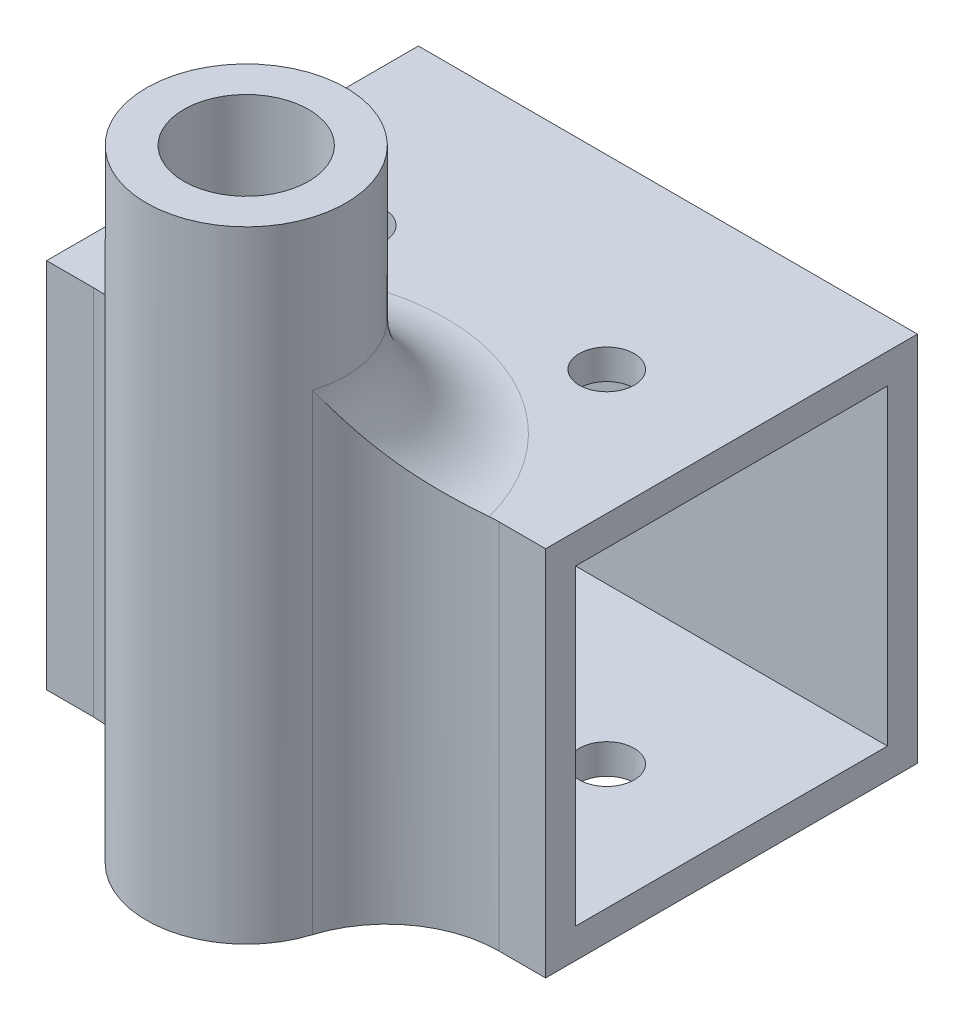
ISO-10303-21;
HEADER;
FILE_DESCRIPTION(('STEP AP214'),'2;1');
FILE_NAME('part.step','',(''),(''),'','','');
FILE_SCHEMA(('AUTOMOTIVE_DESIGN { 1 0 10303 214 1 1 1 1 }'));
ENDSEC;
DATA;
#1=APPLICATION_CONTEXT('core data for automotive mechanical design processes');
#2=APPLICATION_PROTOCOL_DEFINITION('international standard','automotive_design',2000,#1);
#3=PRODUCT_CONTEXT('',#1,'mechanical');
#4=PRODUCT('Part','Part','',(#3));
#5=PRODUCT_RELATED_PRODUCT_CATEGORY('part','',(#4));
#6=PRODUCT_DEFINITION_FORMATION('','',#4);
#7=PRODUCT_DEFINITION_CONTEXT('part definition',#1,'design');
#8=PRODUCT_DEFINITION('design','',#6,#7);
#9=PRODUCT_DEFINITION_SHAPE('','',#8);
#10=(LENGTH_UNIT() NAMED_UNIT(*) SI_UNIT(.MILLI.,.METRE.));
#11=(NAMED_UNIT(*) PLANE_ANGLE_UNIT() SI_UNIT($,.RADIAN.));
#12=(NAMED_UNIT(*) SI_UNIT($,.STERADIAN.) SOLID_ANGLE_UNIT());
#13=UNCERTAINTY_MEASURE_WITH_UNIT(LENGTH_MEASURE(1.E-05),#10,'distance_accuracy_value','');
#14=(GEOMETRIC_REPRESENTATION_CONTEXT(3) GLOBAL_UNCERTAINTY_ASSIGNED_CONTEXT((#13)) GLOBAL_UNIT_ASSIGNED_CONTEXT((#10,
#11,#12)) REPRESENTATION_CONTEXT('',''));
#15=CARTESIAN_POINT('',(0.,0.,0.));
#16=DIRECTION('',(0.,0.,1.));
#17=DIRECTION('',(1.,0.,0.));
#18=AXIS2_PLACEMENT_3D('',#15,#16,#17);
#19=CARTESIAN_POINT('',(40.,0.,14.9));
#20=DIRECTION('',(0.,0.,-1.));
#21=DIRECTION('',(-1.,0.,0.));
#22=AXIS2_PLACEMENT_3D('',#19,#20,#21);
#23=PLANE('',#22);
#24=DIRECTION('',(-1.,0.,0.));
#25=VECTOR('',#24,1.);
#26=CARTESIAN_POINT('',(40.,14.9,14.9));
#27=LINE('',#26,#25);
#28=CARTESIAN_POINT('',(40.,14.9,14.9));
#29=VERTEX_POINT('',#28);
#30=CARTESIAN_POINT('',(36.2480768092719,14.9,14.9));
#31=VERTEX_POINT('',#30);
#32=EDGE_CURVE('E230',#29,#31,#27,.T.);
#33=ORIENTED_EDGE('',*,*,#32,.T.);
#34=DIRECTION('',(0.,1.,0.));
#35=VECTOR('',#34,1.);
#36=CARTESIAN_POINT('',(36.2480768092719,-14.9,14.9));
#37=LINE('',#36,#35);
#38=CARTESIAN_POINT('',(36.2480768092719,-14.9,14.9));
#39=VERTEX_POINT('',#38);
#40=EDGE_CURVE('E241',#31,#39,#37,.F.);
#41=ORIENTED_EDGE('',*,*,#40,.T.);
#42=DIRECTION('',(-1.,0.,0.));
#43=VECTOR('',#42,1.);
#44=CARTESIAN_POINT('',(40.,-14.9,14.9));
#45=LINE('',#44,#43);
#46=CARTESIAN_POINT('',(40.,-14.9,14.9));
#47=VERTEX_POINT('',#46);
#48=EDGE_CURVE('E226',#47,#39,#45,.T.);
#49=ORIENTED_EDGE('',*,*,#48,.F.);
#50=DIRECTION('',(0.,-1.,0.));
#51=VECTOR('',#50,1.);
#52=CARTESIAN_POINT('',(40.,0.,14.9));
#53=LINE('',#52,#51);
#54=EDGE_CURVE('E209',#29,#47,#53,.T.);
#55=ORIENTED_EDGE('',*,*,#54,.F.);
#56=EDGE_LOOP('',(#33,#41,#49,#55));
#57=FACE_BOUND('',#56,.T.);
#58=ADVANCED_FACE('F57',(#57),#23,.F.);
#59=CARTESIAN_POINT('',(3.75192319072808,-14.9,14.9));
#60=VERTEX_POINT('',#59);
#61=CARTESIAN_POINT('',(0.,-14.9,14.9));
#62=VERTEX_POINT('',#61);
#63=EDGE_CURVE('E225',#60,#62,#45,.T.);
#64=ORIENTED_EDGE('',*,*,#63,.F.);
#65=DIRECTION('',(0.,1.,0.));
#66=VECTOR('',#65,1.);
#67=CARTESIAN_POINT('',(3.75192319072808,14.9,14.9));
#68=LINE('',#67,#66);
#69=CARTESIAN_POINT('',(3.75192319072808,14.9,14.9));
#70=VERTEX_POINT('',#69);
#71=EDGE_CURVE('E243',#60,#70,#68,.T.);
#72=ORIENTED_EDGE('',*,*,#71,.T.);
#73=CARTESIAN_POINT('',(0.,14.9,14.9));
#74=VERTEX_POINT('',#73);
#75=EDGE_CURVE('E229',#70,#74,#27,.T.);
#76=ORIENTED_EDGE('',*,*,#75,.T.);
#77=DIRECTION('',(0.,-1.,0.));
#78=VECTOR('',#77,1.);
#79=CARTESIAN_POINT('',(0.,0.,14.9));
#80=LINE('',#79,#78);
#81=EDGE_CURVE('E219',#74,#62,#80,.T.);
#82=ORIENTED_EDGE('',*,*,#81,.T.);
#83=EDGE_LOOP('',(#64,#72,#76,#82));
#84=FACE_BOUND('',#83,.T.);
#85=ADVANCED_FACE('F292',(#84),#23,.F.);
#86=CARTESIAN_POINT('',(40.,-12.5,12.5));
#87=DIRECTION('',(0.,0.,-1.));
#88=DIRECTION('',(-1.,0.,0.));
#89=AXIS2_PLACEMENT_3D('',#86,#87,#88);
#90=PLANE('',#89);
#91=DIRECTION('',(0.,-1.,0.));
#92=VECTOR('',#91,1.);
#93=CARTESIAN_POINT('',(0.,-12.5,12.5));
#94=LINE('',#93,#92);
#95=CARTESIAN_POINT('',(0.,12.5,12.5));
#96=VERTEX_POINT('',#95);
#97=CARTESIAN_POINT('',(0.,-12.5,12.5));
#98=VERTEX_POINT('',#97);
#99=EDGE_CURVE('E194',#96,#98,#94,.T.);
#100=ORIENTED_EDGE('',*,*,#99,.F.);
#101=DIRECTION('',(-1.,0.,0.));
#102=VECTOR('',#101,1.);
#103=CARTESIAN_POINT('',(40.,12.5,12.5));
#104=LINE('',#103,#102);
#105=CARTESIAN_POINT('',(40.,12.5,12.5));
#106=VERTEX_POINT('',#105);
#107=EDGE_CURVE('E178',#106,#96,#104,.T.);
#108=ORIENTED_EDGE('',*,*,#107,.F.);
#109=DIRECTION('',(0.,-1.,0.));
#110=VECTOR('',#109,1.);
#111=CARTESIAN_POINT('',(40.,-12.5,12.5));
#112=LINE('',#111,#110);
#113=CARTESIAN_POINT('',(40.,-12.5,12.5));
#114=VERTEX_POINT('',#113);
#115=EDGE_CURVE('E183',#106,#114,#112,.T.);
#116=ORIENTED_EDGE('',*,*,#115,.T.);
#117=DIRECTION('',(-1.,0.,0.));
#118=VECTOR('',#117,1.);
#119=CARTESIAN_POINT('',(40.,-12.5,12.5));
#120=LINE('',#119,#118);
#121=EDGE_CURVE('E200',#114,#98,#120,.T.);
#122=ORIENTED_EDGE('',*,*,#121,.T.);
#123=EDGE_LOOP('',(#100,#108,#116,#122));
#124=FACE_BOUND('',#123,.T.);
#125=ADVANCED_FACE('F302',(#124),#90,.T.);
#126=CARTESIAN_POINT('',(40.,0.,0.));
#127=DIRECTION('',(1.,0.,0.));
#128=DIRECTION('',(0.,0.,-1.));
#129=AXIS2_PLACEMENT_3D('',#126,#127,#128);
#130=PLANE('',#129);
#131=DIRECTION('',(0.,1.,0.));
#132=VECTOR('',#131,1.);
#133=CARTESIAN_POINT('',(40.,0.,-14.9));
#134=LINE('',#133,#132);
#135=CARTESIAN_POINT('',(40.,-14.9,-14.9));
#136=VERTEX_POINT('',#135);
#137=CARTESIAN_POINT('',(40.,14.9,-14.9));
#138=VERTEX_POINT('',#137);
#139=EDGE_CURVE('E203',#136,#138,#134,.T.);
#140=ORIENTED_EDGE('',*,*,#139,.T.);
#141=DIRECTION('',(0.,0.,1.));
#142=VECTOR('',#141,1.);
#143=CARTESIAN_POINT('',(40.,14.9,0.));
#144=LINE('',#143,#142);
#145=EDGE_CURVE('E206',#138,#29,#144,.T.);
#146=ORIENTED_EDGE('',*,*,#145,.T.);
#147=ORIENTED_EDGE('',*,*,#54,.T.);
#148=DIRECTION('',(0.,0.,-1.));
#149=VECTOR('',#148,1.);
#150=CARTESIAN_POINT('',(40.,-14.9,0.));
#151=LINE('',#150,#149);
#152=EDGE_CURVE('E211',#47,#136,#151,.T.);
#153=ORIENTED_EDGE('',*,*,#152,.T.);
#154=EDGE_LOOP('',(#140,#146,#147,#153));
#155=FACE_BOUND('',#154,.T.);
#156=DIRECTION('',(0.,0.,1.));
#157=VECTOR('',#156,1.);
#158=CARTESIAN_POINT('',(40.,12.5,12.5));
#159=LINE('',#158,#157);
#160=CARTESIAN_POINT('',(40.,12.5,-12.5));
#161=VERTEX_POINT('',#160);
#162=EDGE_CURVE('E169',#161,#106,#159,.T.);
#163=ORIENTED_EDGE('',*,*,#162,.F.);
#164=DIRECTION('',(0.,1.,0.));
#165=VECTOR('',#164,1.);
#166=CARTESIAN_POINT('',(40.,-12.5,-12.5));
#167=LINE('',#166,#165);
#168=CARTESIAN_POINT('',(40.,-12.5,-12.5));
#169=VERTEX_POINT('',#168);
#170=EDGE_CURVE('E159',#169,#161,#167,.T.);
#171=ORIENTED_EDGE('',*,*,#170,.F.);
#172=DIRECTION('',(0.,0.,-1.));
#173=VECTOR('',#172,1.);
#174=CARTESIAN_POINT('',(40.,-12.5,12.5));
#175=LINE('',#174,#173);
#176=EDGE_CURVE('E185',#114,#169,#175,.T.);
#177=ORIENTED_EDGE('',*,*,#176,.F.);
#178=ORIENTED_EDGE('',*,*,#115,.F.);
#179=EDGE_LOOP('',(#163,#171,#177,#178));
#180=FACE_BOUND('',#179,.T.);
#181=ADVANCED_FACE('F181',(#155,#180),#130,.T.);
#182=CARTESIAN_POINT('',(0.,0.,0.));
#183=DIRECTION('',(1.,0.,0.));
#184=DIRECTION('',(0.,0.,-1.));
#185=AXIS2_PLACEMENT_3D('',#182,#183,#184);
#186=PLANE('',#185);
#187=DIRECTION('',(0.,1.,0.));
#188=VECTOR('',#187,1.);
#189=CARTESIAN_POINT('',(0.,0.,-14.9));
#190=LINE('',#189,#188);
#191=CARTESIAN_POINT('',(0.,-14.9,-14.9));
#192=VERTEX_POINT('',#191);
#193=CARTESIAN_POINT('',(0.,14.9,-14.9));
#194=VERTEX_POINT('',#193);
#195=EDGE_CURVE('E177',#192,#194,#190,.T.);
#196=ORIENTED_EDGE('',*,*,#195,.F.);
#197=DIRECTION('',(0.,0.,-1.));
#198=VECTOR('',#197,1.);
#199=CARTESIAN_POINT('',(0.,-14.9,0.));
#200=LINE('',#199,#198);
#201=EDGE_CURVE('E207',#62,#192,#200,.T.);
#202=ORIENTED_EDGE('',*,*,#201,.F.);
#203=ORIENTED_EDGE('',*,*,#81,.F.);
#204=DIRECTION('',(0.,0.,1.));
#205=VECTOR('',#204,1.);
#206=CARTESIAN_POINT('',(0.,14.9,0.));
#207=LINE('',#206,#205);
#208=EDGE_CURVE('E216',#194,#74,#207,.T.);
#209=ORIENTED_EDGE('',*,*,#208,.F.);
#210=EDGE_LOOP('',(#196,#202,#203,#209));
#211=FACE_BOUND('',#210,.T.);
#212=DIRECTION('',(0.,1.,0.));
#213=VECTOR('',#212,1.);
#214=CARTESIAN_POINT('',(0.,-12.5,-12.5));
#215=LINE('',#214,#213);
#216=CARTESIAN_POINT('',(0.,-12.5,-12.5));
#217=VERTEX_POINT('',#216);
#218=CARTESIAN_POINT('',(0.,12.5,-12.5));
#219=VERTEX_POINT('',#218);
#220=EDGE_CURVE('E190',#217,#219,#215,.T.);
#221=ORIENTED_EDGE('',*,*,#220,.T.);
#222=DIRECTION('',(0.,0.,1.));
#223=VECTOR('',#222,1.);
#224=CARTESIAN_POINT('',(0.,12.5,12.5));
#225=LINE('',#224,#223);
#226=EDGE_CURVE('E176',#219,#96,#225,.T.);
#227=ORIENTED_EDGE('',*,*,#226,.T.);
#228=ORIENTED_EDGE('',*,*,#99,.T.);
#229=DIRECTION('',(0.,0.,-1.));
#230=VECTOR('',#229,1.);
#231=CARTESIAN_POINT('',(0.,-12.5,12.5));
#232=LINE('',#231,#230);
#233=EDGE_CURVE('E170',#98,#217,#232,.T.);
#234=ORIENTED_EDGE('',*,*,#233,.T.);
#235=EDGE_LOOP('',(#221,#227,#228,#234));
#236=FACE_BOUND('',#235,.T.);
#237=ADVANCED_FACE('F284',(#211,#236),#186,.F.);
#238=CARTESIAN_POINT('',(40.,0.,-14.9));
#239=DIRECTION('',(0.,0.,1.));
#240=DIRECTION('',(1.,0.,0.));
#241=AXIS2_PLACEMENT_3D('',#238,#239,#240);
#242=PLANE('',#241);
#243=ORIENTED_EDGE('',*,*,#195,.T.);
#244=DIRECTION('',(-1.,0.,0.));
#245=VECTOR('',#244,1.);
#246=CARTESIAN_POINT('',(40.,14.9,-14.9));
#247=LINE('',#246,#245);
#248=EDGE_CURVE('E233',#138,#194,#247,.T.);
#249=ORIENTED_EDGE('',*,*,#248,.F.);
#250=ORIENTED_EDGE('',*,*,#139,.F.);
#251=DIRECTION('',(-1.,0.,0.));
#252=VECTOR('',#251,1.);
#253=CARTESIAN_POINT('',(40.,-14.9,-14.9));
#254=LINE('',#253,#252);
#255=EDGE_CURVE('E213',#136,#192,#254,.T.);
#256=ORIENTED_EDGE('',*,*,#255,.T.);
#257=EDGE_LOOP('',(#243,#249,#250,#256));
#258=FACE_BOUND('',#257,.T.);
#259=ADVANCED_FACE('F280',(#258),#242,.F.);
#260=CARTESIAN_POINT('',(40.,14.9,0.));
#261=DIRECTION('',(0.,-1.,0.));
#262=DIRECTION('',(0.,0.,-1.));
#263=AXIS2_PLACEMENT_3D('',#260,#261,#262);
#264=PLANE('',#263);
#265=CARTESIAN_POINT('',(10.,14.9,0.));
#266=DIRECTION('',(0.,-1.,0.));
#267=DIRECTION('',(0.,0.,-1.));
#268=AXIS2_PLACEMENT_3D('',#265,#266,#267);
#269=CIRCLE('',#268,2.2);
#270=CARTESIAN_POINT('',(10.,14.9,-2.2));
#271=VERTEX_POINT('',#270);
#272=EDGE_CURVE('E352',#271,#271,#269,.F.);
#273=ORIENTED_EDGE('',*,*,#272,.F.);
#274=EDGE_LOOP('',(#273));
#275=FACE_BOUND('',#274,.T.);
#276=CARTESIAN_POINT('',(30.,14.9,0.));
#277=DIRECTION('',(0.,-1.,0.));
#278=DIRECTION('',(0.,0.,-1.));
#279=AXIS2_PLACEMENT_3D('',#276,#277,#278);
#280=CIRCLE('',#279,2.2);
#281=CARTESIAN_POINT('',(30.,14.9,-2.2));
#282=VERTEX_POINT('',#281);
#283=EDGE_CURVE('E263',#282,#282,#280,.F.);
#284=ORIENTED_EDGE('',*,*,#283,.F.);
#285=EDGE_LOOP('',(#284));
#286=FACE_BOUND('',#285,.T.);
#287=CARTESIAN_POINT('',(3.75192319072808,14.9,23.9));
#288=DIRECTION('',(0.,-1.,0.));
#289=DIRECTION('',(0.,0.,-1.));
#290=AXIS2_PLACEMENT_3D('',#287,#288,#289);
#291=CIRCLE('',#290,9.);
#292=CARTESIAN_POINT('',(4.50005746116596,14.9,14.9311486179446));
#293=VERTEX_POINT('',#292);
#294=EDGE_CURVE('E251',#70,#293,#291,.T.);
#295=ORIENTED_EDGE('',*,*,#294,.T.);
#296=CARTESIAN_POINT('',(20.,14.9,18.9));
#297=DIRECTION('',(0.,-1.,0.));
#298=DIRECTION('',(0.,0.,-1.));
#299=AXIS2_PLACEMENT_3D('',#296,#297,#298);
#300=CIRCLE('',#299,16.);
#301=CARTESIAN_POINT('',(35.4999425388341,14.9,14.9311486179446));
#302=VERTEX_POINT('',#301);
#303=EDGE_CURVE('E84',#293,#302,#300,.T.);
#304=ORIENTED_EDGE('',*,*,#303,.T.);
#305=CARTESIAN_POINT('',(36.2480768092719,14.9,23.9));
#306=DIRECTION('',(0.,-1.,0.));
#307=DIRECTION('',(0.,0.,-1.));
#308=AXIS2_PLACEMENT_3D('',#305,#306,#307);
#309=CIRCLE('',#308,9.);
#310=EDGE_CURVE('E245',#302,#31,#309,.T.);
#311=ORIENTED_EDGE('',*,*,#310,.T.);
#312=ORIENTED_EDGE('',*,*,#32,.F.);
#313=ORIENTED_EDGE('',*,*,#145,.F.);
#314=ORIENTED_EDGE('',*,*,#248,.T.);
#315=ORIENTED_EDGE('',*,*,#208,.T.);
#316=ORIENTED_EDGE('',*,*,#75,.F.);
#317=EDGE_LOOP('',(#295,#304,#311,#312,#313,#314,#315,#316));
#318=FACE_BOUND('',#317,.T.);
#319=ADVANCED_FACE('F283',(#275,#286,#318),#264,.F.);
#320=CARTESIAN_POINT('',(40.,-14.9,0.));
#321=DIRECTION('',(0.,1.,0.));
#322=DIRECTION('',(0.,0.,1.));
#323=AXIS2_PLACEMENT_3D('',#320,#321,#322);
#324=PLANE('',#323);
#325=CARTESIAN_POINT('',(10.,-14.9,0.));
#326=DIRECTION('',(0.,1.,0.));
#327=DIRECTION('',(0.,0.,1.));
#328=AXIS2_PLACEMENT_3D('',#325,#326,#327);
#329=CIRCLE('',#328,2.2);
#330=CARTESIAN_POINT('',(10.,-14.9,2.2));
#331=VERTEX_POINT('',#330);
#332=EDGE_CURVE('E258',#331,#331,#329,.T.);
#333=ORIENTED_EDGE('',*,*,#332,.T.);
#334=EDGE_LOOP('',(#333));
#335=FACE_BOUND('',#334,.T.);
#336=CARTESIAN_POINT('',(30.,-14.9,0.));
#337=DIRECTION('',(0.,1.,0.));
#338=DIRECTION('',(0.,0.,1.));
#339=AXIS2_PLACEMENT_3D('',#336,#337,#338);
#340=CIRCLE('',#339,2.2);
#341=CARTESIAN_POINT('',(30.,-14.9,2.2));
#342=VERTEX_POINT('',#341);
#343=EDGE_CURVE('E540',#342,#342,#340,.T.);
#344=ORIENTED_EDGE('',*,*,#343,.T.);
#345=EDGE_LOOP('',(#344));
#346=FACE_BOUND('',#345,.T.);
#347=ORIENTED_EDGE('',*,*,#48,.T.);
#348=CARTESIAN_POINT('',(36.2480768092719,-14.9,23.9));
#349=DIRECTION('',(0.,1.,0.));
#350=DIRECTION('',(0.,0.,1.));
#351=AXIS2_PLACEMENT_3D('',#348,#349,#350);
#352=CIRCLE('',#351,9.);
#353=CARTESIAN_POINT('',(27.6461537925986,-14.9,21.2529411764706));
#354=VERTEX_POINT('',#353);
#355=EDGE_CURVE('E247',#39,#354,#352,.T.);
#356=ORIENTED_EDGE('',*,*,#355,.T.);
#357=CARTESIAN_POINT('',(20.,-14.9,18.9));
#358=DIRECTION('',(0.,1.,0.));
#359=DIRECTION('',(0.,0.,1.));
#360=AXIS2_PLACEMENT_3D('',#357,#358,#359);
#361=CIRCLE('',#360,8.);
#362=CARTESIAN_POINT('',(12.3538462074015,-14.9,21.2529411764706));
#363=VERTEX_POINT('',#362);
#364=EDGE_CURVE('E356',#354,#363,#361,.F.);
#365=ORIENTED_EDGE('',*,*,#364,.T.);
#366=CARTESIAN_POINT('',(3.75192319072808,-14.9,23.9));
#367=DIRECTION('',(0.,1.,0.));
#368=DIRECTION('',(0.,0.,1.));
#369=AXIS2_PLACEMENT_3D('',#366,#367,#368);
#370=CIRCLE('',#369,9.);
#371=EDGE_CURVE('E249',#363,#60,#370,.T.);
#372=ORIENTED_EDGE('',*,*,#371,.T.);
#373=ORIENTED_EDGE('',*,*,#63,.T.);
#374=ORIENTED_EDGE('',*,*,#201,.T.);
#375=ORIENTED_EDGE('',*,*,#255,.F.);
#376=ORIENTED_EDGE('',*,*,#152,.F.);
#377=EDGE_LOOP('',(#347,#356,#365,#372,#373,#374,#375,#376));
#378=FACE_BOUND('',#377,.T.);
#379=CARTESIAN_POINT('',(20.,-14.9,18.9));
#380=DIRECTION('',(0.,1.,0.));
#381=DIRECTION('',(0.,0.,1.));
#382=AXIS2_PLACEMENT_3D('',#379,#380,#381);
#383=CIRCLE('',#382,5.);
#384=CARTESIAN_POINT('',(20.,-14.9,23.9));
#385=VERTEX_POINT('',#384);
#386=EDGE_CURVE('E353',#385,#385,#383,.F.);
#387=ORIENTED_EDGE('',*,*,#386,.F.);
#388=EDGE_LOOP('',(#387));
#389=FACE_BOUND('',#388,.T.);
#390=ADVANCED_FACE('F288',(#335,#346,#378,#389),#324,.F.);
#391=CARTESIAN_POINT('',(40.,-12.5,-12.5));
#392=DIRECTION('',(0.,0.,1.));
#393=DIRECTION('',(1.,0.,0.));
#394=AXIS2_PLACEMENT_3D('',#391,#392,#393);
#395=PLANE('',#394);
#396=ORIENTED_EDGE('',*,*,#220,.F.);
#397=DIRECTION('',(-1.,0.,0.));
#398=VECTOR('',#397,1.);
#399=CARTESIAN_POINT('',(40.,-12.5,-12.5));
#400=LINE('',#399,#398);
#401=EDGE_CURVE('E165',#169,#217,#400,.T.);
#402=ORIENTED_EDGE('',*,*,#401,.F.);
#403=ORIENTED_EDGE('',*,*,#170,.T.);
#404=DIRECTION('',(-1.,0.,0.));
#405=VECTOR('',#404,1.);
#406=CARTESIAN_POINT('',(40.,12.5,-12.5));
#407=LINE('',#406,#405);
#408=EDGE_CURVE('E162',#161,#219,#407,.T.);
#409=ORIENTED_EDGE('',*,*,#408,.T.);
#410=EDGE_LOOP('',(#396,#402,#403,#409));
#411=FACE_BOUND('',#410,.T.);
#412=ADVANCED_FACE('F161',(#411),#395,.T.);
#413=CARTESIAN_POINT('',(40.,12.5,12.5));
#414=DIRECTION('',(0.,-1.,0.));
#415=DIRECTION('',(0.,0.,-1.));
#416=AXIS2_PLACEMENT_3D('',#413,#414,#415);
#417=PLANE('',#416);
#418=CARTESIAN_POINT('',(10.,12.5,0.));
#419=DIRECTION('',(0.,-1.,0.));
#420=DIRECTION('',(0.,0.,-1.));
#421=AXIS2_PLACEMENT_3D('',#418,#419,#420);
#422=CIRCLE('',#421,2.2);
#423=CARTESIAN_POINT('',(10.,12.5,-2.2));
#424=VERTEX_POINT('',#423);
#425=EDGE_CURVE('E262',#424,#424,#422,.F.);
#426=ORIENTED_EDGE('',*,*,#425,.T.);
#427=EDGE_LOOP('',(#426));
#428=FACE_BOUND('',#427,.T.);
#429=CARTESIAN_POINT('',(30.,12.5,0.));
#430=DIRECTION('',(0.,-1.,0.));
#431=DIRECTION('',(0.,0.,-1.));
#432=AXIS2_PLACEMENT_3D('',#429,#430,#431);
#433=CIRCLE('',#432,2.2);
#434=CARTESIAN_POINT('',(30.,12.5,-2.2));
#435=VERTEX_POINT('',#434);
#436=EDGE_CURVE('E257',#435,#435,#433,.F.);
#437=ORIENTED_EDGE('',*,*,#436,.T.);
#438=EDGE_LOOP('',(#437));
#439=FACE_BOUND('',#438,.T.);
#440=ORIENTED_EDGE('',*,*,#107,.T.);
#441=ORIENTED_EDGE('',*,*,#226,.F.);
#442=ORIENTED_EDGE('',*,*,#408,.F.);
#443=ORIENTED_EDGE('',*,*,#162,.T.);
#444=EDGE_LOOP('',(#440,#441,#442,#443));
#445=FACE_BOUND('',#444,.T.);
#446=ADVANCED_FACE('F173',(#428,#439,#445),#417,.T.);
#447=CARTESIAN_POINT('',(40.,-12.5,12.5));
#448=DIRECTION('',(0.,1.,0.));
#449=DIRECTION('',(0.,0.,1.));
#450=AXIS2_PLACEMENT_3D('',#447,#448,#449);
#451=PLANE('',#450);
#452=CARTESIAN_POINT('',(10.,-12.5,0.));
#453=DIRECTION('',(0.,1.,0.));
#454=DIRECTION('',(0.,0.,1.));
#455=AXIS2_PLACEMENT_3D('',#452,#453,#454);
#456=CIRCLE('',#455,2.2);
#457=CARTESIAN_POINT('',(10.,-12.5,2.2));
#458=VERTEX_POINT('',#457);
#459=EDGE_CURVE('E259',#458,#458,#456,.F.);
#460=ORIENTED_EDGE('',*,*,#459,.T.);
#461=EDGE_LOOP('',(#460));
#462=FACE_BOUND('',#461,.T.);
#463=CARTESIAN_POINT('',(30.,-12.5,0.));
#464=DIRECTION('',(0.,1.,0.));
#465=DIRECTION('',(0.,0.,1.));
#466=AXIS2_PLACEMENT_3D('',#463,#464,#465);
#467=CIRCLE('',#466,2.2);
#468=CARTESIAN_POINT('',(30.,-12.5,2.2));
#469=VERTEX_POINT('',#468);
#470=EDGE_CURVE('E254',#469,#469,#467,.F.);
#471=ORIENTED_EDGE('',*,*,#470,.T.);
#472=EDGE_LOOP('',(#471));
#473=FACE_BOUND('',#472,.T.);
#474=ORIENTED_EDGE('',*,*,#233,.F.);
#475=ORIENTED_EDGE('',*,*,#121,.F.);
#476=ORIENTED_EDGE('',*,*,#176,.T.);
#477=ORIENTED_EDGE('',*,*,#401,.T.);
#478=EDGE_LOOP('',(#474,#475,#476,#477));
#479=FACE_BOUND('',#478,.T.);
#480=ADVANCED_FACE('F308',(#462,#473,#479),#451,.T.);
#481=CARTESIAN_POINT('',(20.,34.9,18.9));
#482=DIRECTION('',(0.,-1.,0.));
#483=DIRECTION('',(0.,0.,-1.));
#484=AXIS2_PLACEMENT_3D('',#481,#482,#483);
#485=CYLINDRICAL_SURFACE('',#484,5.);
#486=ORIENTED_EDGE('',*,*,#386,.T.);
#487=EDGE_LOOP('',(#486));
#488=FACE_BOUND('',#487,.T.);
#489=CARTESIAN_POINT('',(20.,34.9,18.9));
#490=DIRECTION('',(0.,1.,0.));
#491=DIRECTION('',(0.,0.,1.));
#492=AXIS2_PLACEMENT_3D('',#489,#490,#491);
#493=CIRCLE('',#492,5.);
#494=CARTESIAN_POINT('',(20.,34.9,23.9));
#495=VERTEX_POINT('',#494);
#496=EDGE_CURVE('E362',#495,#495,#493,.T.);
#497=ORIENTED_EDGE('',*,*,#496,.T.);
#498=EDGE_LOOP('',(#497));
#499=FACE_BOUND('',#498,.T.);
#500=ADVANCED_FACE('F315',(#488,#499),#485,.F.);
#501=CARTESIAN_POINT('',(20.,34.9,18.9));
#502=DIRECTION('',(0.,-1.,0.));
#503=DIRECTION('',(0.,0.,-1.));
#504=AXIS2_PLACEMENT_3D('',#501,#502,#503);
#505=CYLINDRICAL_SURFACE('',#504,8.);
#506=CARTESIAN_POINT('',(20.,34.9,18.9));
#507=DIRECTION('',(0.,1.,0.));
#508=DIRECTION('',(0.,0.,1.));
#509=AXIS2_PLACEMENT_3D('',#506,#507,#508);
#510=CIRCLE('',#509,8.);
#511=CARTESIAN_POINT('',(20.,34.9,26.9));
#512=VERTEX_POINT('',#511);
#513=EDGE_CURVE('E192',#512,#512,#510,.T.);
#514=ORIENTED_EDGE('',*,*,#513,.F.);
#515=EDGE_LOOP('',(#514));
#516=FACE_BOUND('',#515,.T.);
#517=CARTESIAN_POINT('',(20.,22.9,18.9));
#518=DIRECTION('',(0.,-1.,0.));
#519=DIRECTION('',(0.,0.,-1.));
#520=AXIS2_PLACEMENT_3D('',#517,#518,#519);
#521=CIRCLE('',#520,8.);
#522=CARTESIAN_POINT('',(27.6461537925986,22.9,21.2529411764706));
#523=VERTEX_POINT('',#522);
#524=CARTESIAN_POINT('',(12.3538462074015,22.9,21.2529411764706));
#525=VERTEX_POINT('',#524);
#526=EDGE_CURVE('E253',#523,#525,#521,.F.);
#527=ORIENTED_EDGE('',*,*,#526,.T.);
#528=DIRECTION('',(0.,-1.,0.));
#529=VECTOR('',#528,1.);
#530=CARTESIAN_POINT('',(12.3538462074014,34.9,21.2529411764706));
#531=LINE('',#530,#529);
#532=EDGE_CURVE('E236',#525,#363,#531,.T.);
#533=ORIENTED_EDGE('',*,*,#532,.T.);
#534=ORIENTED_EDGE('',*,*,#364,.F.);
#535=DIRECTION('',(0.,-1.,0.));
#536=VECTOR('',#535,1.);
#537=CARTESIAN_POINT('',(27.6461537925986,34.9,21.2529411764706));
#538=LINE('',#537,#536);
#539=EDGE_CURVE('E239',#354,#523,#538,.F.);
#540=ORIENTED_EDGE('',*,*,#539,.T.);
#541=EDGE_LOOP('',(#527,#533,#534,#540));
#542=FACE_BOUND('',#541,.T.);
#543=ADVANCED_FACE('F317',(#516,#542),#505,.T.);
#544=CARTESIAN_POINT('',(20.,34.9,18.9));
#545=DIRECTION('',(0.,1.,0.));
#546=DIRECTION('',(0.,0.,1.));
#547=AXIS2_PLACEMENT_3D('',#544,#545,#546);
#548=PLANE('',#547);
#549=ORIENTED_EDGE('',*,*,#513,.T.);
#550=EDGE_LOOP('',(#549));
#551=FACE_BOUND('',#550,.T.);
#552=ORIENTED_EDGE('',*,*,#496,.F.);
#553=EDGE_LOOP('',(#552));
#554=FACE_BOUND('',#553,.T.);
#555=ADVANCED_FACE('F278',(#551,#554),#548,.T.);
#556=CARTESIAN_POINT('',(36.2480768092719,34.9,23.9));
#557=DIRECTION('',(0.,-1.,0.));
#558=DIRECTION('',(0.,0.,-1.));
#559=AXIS2_PLACEMENT_3D('',#556,#557,#558);
#560=CYLINDRICAL_SURFACE('',#559,9.);
#561=ORIENTED_EDGE('',*,*,#355,.F.);
#562=ORIENTED_EDGE('',*,*,#40,.F.);
#563=ORIENTED_EDGE('',*,*,#310,.F.);
#564=CARTESIAN_POINT('',(35.4999425388341,14.9,14.9311486179446));
#565=CARTESIAN_POINT('',(35.3201297239677,14.8999633327173,14.9461049694215));
#566=CARTESIAN_POINT('',(35.140772590652,14.9059324611899,14.9665518330815));
#567=CARTESIAN_POINT('',(34.7844525374695,14.9299556872337,15.0179962549238));
#568=CARTESIAN_POINT('',(34.6074888968897,14.9480060604286,15.0489905601199));
#569=CARTESIAN_POINT('',(34.2584871698792,14.9961050208667,15.1208701439967));
#570=CARTESIAN_POINT('',(34.0864242017687,15.0260732473925,15.1616884670139));
#571=CARTESIAN_POINT('',(33.7473000993327,15.0978149359492,15.2526348748396));
#572=CARTESIAN_POINT('',(33.5802390046499,15.1395884915163,15.3027630334107));
#573=CARTESIAN_POINT('',(33.2524053657495,15.2345092387816,15.4114340001334));
#574=CARTESIAN_POINT('',(33.0916268108936,15.2876452282375,15.4699685019253));
#575=CARTESIAN_POINT('',(32.7770190712778,15.4047725584078,15.5945559680828));
#576=CARTESIAN_POINT('',(32.6231929585093,15.4687686394911,15.660612211486));
#577=CARTESIAN_POINT('',(32.3231138148619,15.6069459071707,15.7992588834465));
#578=CARTESIAN_POINT('',(32.1768663629136,15.6811344541577,15.8718540208364));
#579=CARTESIAN_POINT('',(31.8924548764489,15.8388715741798,16.0225338859169));
#580=CARTESIAN_POINT('',(31.7542928015047,15.9224224020736,16.1006199343722));
#581=CARTESIAN_POINT('',(31.4352325195734,16.1314808837911,16.2919077432189));
#582=CARTESIAN_POINT('',(31.258085607722,16.2608533926758,16.4071621094241));
#583=CARTESIAN_POINT('',(30.9195284984236,16.5336108939583,16.64401616254));
#584=CARTESIAN_POINT('',(30.7581241314152,16.6770010388824,16.7656181749718));
#585=CARTESIAN_POINT('',(30.4501845092611,16.9759552032348,17.0135203698805));
#586=CARTESIAN_POINT('',(30.3036799939649,17.1315432628989,17.1398295588475));
#587=CARTESIAN_POINT('',(30.0249713233603,17.4527523249697,17.3954847024188));
#588=CARTESIAN_POINT('',(29.8927725631876,17.6183770760381,17.5248317804771));
#589=CARTESIAN_POINT('',(29.557289074355,18.0719825584959,17.8729758862281));
#590=CARTESIAN_POINT('',(29.3658846027964,18.3674389232126,18.0935108550988));
#591=CARTESIAN_POINT('',(29.0149487397433,18.9750610717329,18.5369889962135));
#592=CARTESIAN_POINT('',(28.8554440096238,19.2872405585297,18.7599340200874));
#593=CARTESIAN_POINT('',(28.5636780908225,19.9232669611572,19.2073084522909));
#594=CARTESIAN_POINT('',(28.4314351513936,20.2471215230844,19.4317387518153));
#595=CARTESIAN_POINT('',(28.190606619672,20.9020871567711,19.8822390317083));
#596=CARTESIAN_POINT('',(28.0820111588147,21.2331951377975,20.1083082872521));
#597=CARTESIAN_POINT('',(27.9193772786473,21.7851162977037,20.4854422714363));
#598=CARTESIAN_POINT('',(27.8594017110168,22.0048074213045,20.6356376564757));
#599=CARTESIAN_POINT('',(27.7480109529094,22.4448473270408,20.937771867193));
#600=CARTESIAN_POINT('',(27.6965874416197,22.6651952550655,21.0897088426474));
#601=CARTESIAN_POINT('',(27.6482194219723,22.8903567999543,21.2462356659028));
#602=CARTESIAN_POINT('',(27.6471856285475,22.895178404215,21.2495881232429));
#603=CARTESIAN_POINT('',(27.6461537925986,22.9,21.2529411764706));
#604=B_SPLINE_CURVE_WITH_KNOTS('',3,(#564,#565,#566,#567,#568,#569,#570,#571,#572,#573,#574,
#575,#576,#577,#578,#579,#580,#581,#582,#583,#584,#585,#586,#587,#588,#589,#590,#591,#592,#593,
#594,#595,#596,#597,#598,#599,#600,#601,#602,#603),.UNSPECIFIED.,.F.,.F.,(4,2,2,2,2,2,2,2,2,2,2,
2,2,2,2,2,2,2,2,4),(0.,0.541120932545734,1.08207512645734,1.61944194888823,2.15681302911499,
2.69365673703727,3.230735379807,3.7682039275603,4.30580220130153,5.04803630869807,
5.79054427570752,6.5345542925252,7.27884392742325,8.52295512439428,9.76810182680764,
11.0140793526688,12.2595359065073,13.0778152572721,13.8952937367554,13.9131822816332),.UNSPECIFIED.);
#605=EDGE_CURVE('E12',#302,#523,#604,.T.);
#606=ORIENTED_EDGE('',*,*,#605,.T.);
#607=ORIENTED_EDGE('',*,*,#539,.F.);
#608=EDGE_LOOP('',(#561,#562,#563,#606,#607));
#609=FACE_BOUND('',#608,.T.);
#610=ADVANCED_FACE('F274',(#609),#560,.F.);
#611=CARTESIAN_POINT('',(3.75192319072808,34.9,23.9));
#612=DIRECTION('',(0.,-1.,0.));
#613=DIRECTION('',(0.,0.,-1.));
#614=AXIS2_PLACEMENT_3D('',#611,#612,#613);
#615=CYLINDRICAL_SURFACE('',#614,9.);
#616=ORIENTED_EDGE('',*,*,#294,.F.);
#617=ORIENTED_EDGE('',*,*,#71,.F.);
#618=ORIENTED_EDGE('',*,*,#371,.F.);
#619=ORIENTED_EDGE('',*,*,#532,.F.);
#620=CARTESIAN_POINT('',(4.50005746116596,14.9,14.9311486179446));
#621=CARTESIAN_POINT('',(4.6798702760323,14.8999633327173,14.9461049694215));
#622=CARTESIAN_POINT('',(4.85922740934792,14.9059324611899,14.9665518330814));
#623=CARTESIAN_POINT('',(5.21554746253039,14.9299556872337,15.0179962549237));
#624=CARTESIAN_POINT('',(5.39251110311015,14.9480060604286,15.0489905601199));
#625=CARTESIAN_POINT('',(5.74151283012057,14.9961050208666,15.1208701439966));
#626=CARTESIAN_POINT('',(5.91357579823115,15.0260732473925,15.1616884670139));
#627=CARTESIAN_POINT('',(6.2526999006672,15.0978149359492,15.2526348748395));
#628=CARTESIAN_POINT('',(6.41976099535011,15.1395884915163,15.3027630334107));
#629=CARTESIAN_POINT('',(6.7475946342505,15.2345092387816,15.4114340001334));
#630=CARTESIAN_POINT('',(6.90837318910643,15.2876452282375,15.4699685019253));
#631=CARTESIAN_POINT('',(7.22298092872232,15.4047725584079,15.5945559680828));
#632=CARTESIAN_POINT('',(7.37680704149082,15.4687686394912,15.6606122114861));
#633=CARTESIAN_POINT('',(7.67688618513823,15.6069459071708,15.7992588834466));
#634=CARTESIAN_POINT('',(7.82313363708649,15.6811344541578,15.8718540208364));
#635=CARTESIAN_POINT('',(8.10754512355121,15.8388715741798,16.0225338859169));
#636=CARTESIAN_POINT('',(8.24570719849533,15.9224224020737,16.1006199343722));
#637=CARTESIAN_POINT('',(8.56476748042656,16.131480883791,16.2919077432188));
#638=CARTESIAN_POINT('',(8.74191439227789,16.2608533926757,16.407162109424));
#639=CARTESIAN_POINT('',(9.08047150157608,16.533610893958,16.6440161625398));
#640=CARTESIAN_POINT('',(9.24187586858443,16.6770010388821,16.7656181749716));
#641=CARTESIAN_POINT('',(9.54981549073859,16.9759552032345,17.0135203698803));
#642=CARTESIAN_POINT('',(9.69632000603487,17.1315432628986,17.1398295588473));
#643=CARTESIAN_POINT('',(9.97502867663963,17.4527523249696,17.3954847024187));
#644=CARTESIAN_POINT('',(10.1072274368124,17.618377076038,17.524831780477));
#645=CARTESIAN_POINT('',(10.4427109256451,18.0719825584961,17.8729758862283));
#646=CARTESIAN_POINT('',(10.6341153972038,18.3674389232129,18.0935108550992));
#647=CARTESIAN_POINT('',(10.9850512602571,18.9750610717337,18.536988996214));
#648=CARTESIAN_POINT('',(11.1445559903766,19.2872405585308,18.7599340200878));
#649=CARTESIAN_POINT('',(11.4363219091779,19.923266961158,19.2073084522917));
#650=CARTESIAN_POINT('',(11.5685648486069,20.2471215230845,19.4317387518165));
#651=CARTESIAN_POINT('',(11.8093933803279,20.902087156772,19.8822390317078));
#652=CARTESIAN_POINT('',(11.9179888411844,21.2331951377999,20.1083082872494));
#653=CARTESIAN_POINT('',(12.0806227213533,21.7851162977023,20.4854422714381));
#654=CARTESIAN_POINT('',(12.1405982889851,22.0048074213001,20.6356376564815));
#655=CARTESIAN_POINT('',(12.2519890470888,22.4448473270452,20.9377718671872));
#656=CARTESIAN_POINT('',(12.3034125583737,22.6651952550819,21.0897088426259));
#657=CARTESIAN_POINT('',(12.3517805780275,22.890356799955,21.2462356659019));
#658=CARTESIAN_POINT('',(12.3528143714523,22.8951784042154,21.2495881232424));
#659=CARTESIAN_POINT('',(12.3538462074015,22.9,21.2529411764706));
#660=B_SPLINE_CURVE_WITH_KNOTS('',3,(#620,#621,#622,#623,#624,#625,#626,#627,#628,#629,#630,
#631,#632,#633,#634,#635,#636,#637,#638,#639,#640,#641,#642,#643,#644,#645,#646,#647,#648,#649,
#650,#651,#652,#653,#654,#655,#656,#657,#658,#659),.UNSPECIFIED.,.F.,.F.,(4,2,2,2,2,2,2,2,2,2,2,
2,2,2,2,2,2,2,2,4),(0.,0.541120932545617,1.08207512645711,1.61944194888811,2.15681302911499,
2.69365673703737,3.23073537980721,3.76820392756041,4.30580220130154,5.04803630869776,
5.79054427570687,6.53455429252488,7.27884392742326,8.52295512439509,9.76810182680907,
11.0140793526694,12.2595359065073,13.077815257272,13.8952937367554,13.9131822816332),.UNSPECIFIED.);
#661=EDGE_CURVE('E71',#525,#293,#660,.F.);
#662=ORIENTED_EDGE('',*,*,#661,.T.);
#663=EDGE_LOOP('',(#616,#617,#618,#619,#662));
#664=FACE_BOUND('',#663,.T.);
#665=ADVANCED_FACE('F270',(#664),#615,.F.);
#666=CARTESIAN_POINT('',(30.,34.9,0.));
#667=DIRECTION('',(0.,-1.,0.));
#668=DIRECTION('',(0.,0.,-1.));
#669=AXIS2_PLACEMENT_3D('',#666,#667,#668);
#670=CYLINDRICAL_SURFACE('',#669,2.2);
#671=ORIENTED_EDGE('',*,*,#470,.F.);
#672=EDGE_LOOP('',(#671));
#673=FACE_BOUND('',#672,.T.);
#674=ORIENTED_EDGE('',*,*,#343,.F.);
#675=EDGE_LOOP('',(#674));
#676=FACE_BOUND('',#675,.T.);
#677=ADVANCED_FACE('F273',(#673,#676),#670,.F.);
#678=CARTESIAN_POINT('',(10.,34.9,0.));
#679=DIRECTION('',(0.,-1.,0.));
#680=DIRECTION('',(0.,0.,-1.));
#681=AXIS2_PLACEMENT_3D('',#678,#679,#680);
#682=CYLINDRICAL_SURFACE('',#681,2.2);
#683=ORIENTED_EDGE('',*,*,#459,.F.);
#684=EDGE_LOOP('',(#683));
#685=FACE_BOUND('',#684,.T.);
#686=ORIENTED_EDGE('',*,*,#332,.F.);
#687=EDGE_LOOP('',(#686));
#688=FACE_BOUND('',#687,.T.);
#689=ADVANCED_FACE('F329',(#685,#688),#682,.F.);
#690=ORIENTED_EDGE('',*,*,#436,.F.);
#691=EDGE_LOOP('',(#690));
#692=FACE_BOUND('',#691,.T.);
#693=ORIENTED_EDGE('',*,*,#283,.T.);
#694=EDGE_LOOP('',(#693));
#695=FACE_BOUND('',#694,.T.);
#696=ADVANCED_FACE('F331',(#692,#695),#670,.F.);
#697=ORIENTED_EDGE('',*,*,#425,.F.);
#698=EDGE_LOOP('',(#697));
#699=FACE_BOUND('',#698,.T.);
#700=ORIENTED_EDGE('',*,*,#272,.T.);
#701=EDGE_LOOP('',(#700));
#702=FACE_BOUND('',#701,.T.);
#703=ADVANCED_FACE('F334',(#699,#702),#682,.F.);
#704=CARTESIAN_POINT('',(20.,22.9,18.9));
#705=DIRECTION('',(0.,-1.,0.));
#706=DIRECTION('',(0.,0.,-1.));
#707=AXIS2_PLACEMENT_3D('',#704,#705,#706);
#708=TOROIDAL_SURFACE('',#707,16.,8.);
#709=ORIENTED_EDGE('',*,*,#605,.F.);
#710=ORIENTED_EDGE('',*,*,#303,.F.);
#711=ORIENTED_EDGE('',*,*,#661,.F.);
#712=ORIENTED_EDGE('',*,*,#526,.F.);
#713=EDGE_LOOP('',(#709,#710,#711,#712));
#714=FACE_BOUND('',#713,.T.);
#715=ADVANCED_FACE('F59',(#714),#708,.F.);
#716=CLOSED_SHELL('',(#58,#85,#125,#181,#237,#259,#319,#390,#412,#446,#480,#500,#543,#555,#610,
#665,#677,#689,#696,#703,#715));
#717=MANIFOLD_SOLID_BREP('B2',#716);
#718=ADVANCED_BREP_SHAPE_REPRESENTATION('',(#18,#717),#14);
#719=SHAPE_DEFINITION_REPRESENTATION(#9,#718);
ENDSEC;
END-ISO-10303-21;
